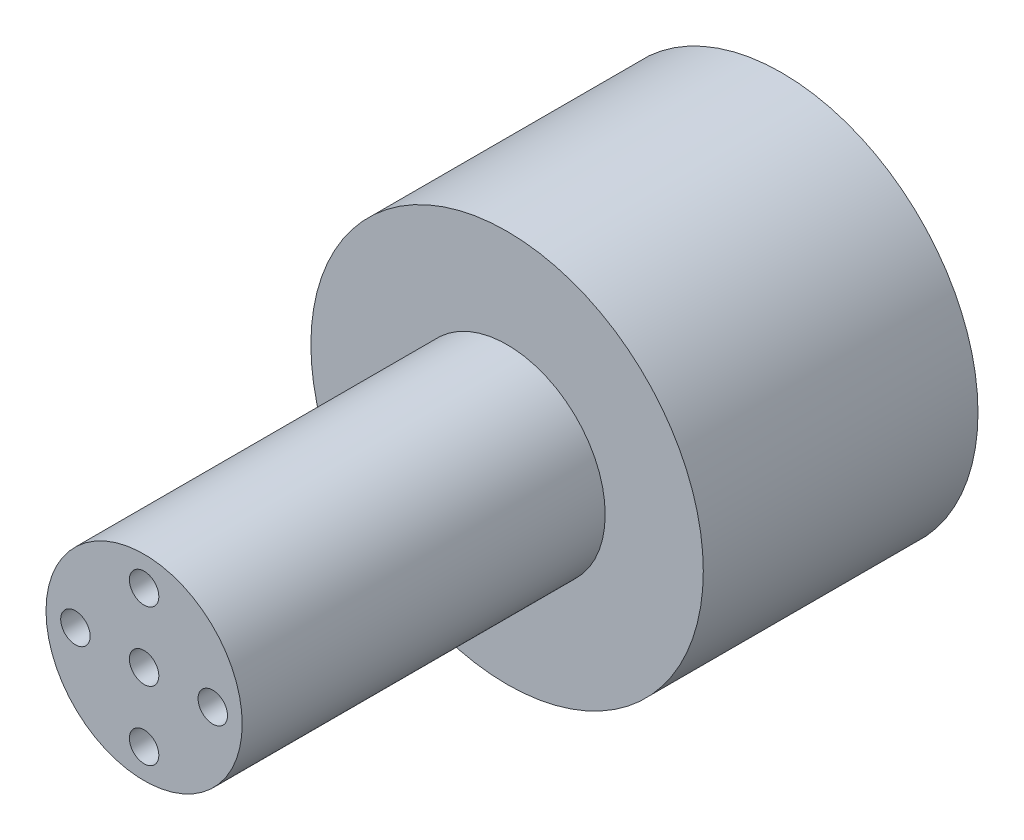
ISO-10303-21;
HEADER;
FILE_DESCRIPTION(('STEP AP214'),'2;1');
FILE_NAME('part.step','',(''),(''),'','','');
FILE_SCHEMA(('AUTOMOTIVE_DESIGN { 1 0 10303 214 1 1 1 1 }'));
ENDSEC;
DATA;
#1=APPLICATION_CONTEXT('core data for automotive mechanical design processes');
#2=APPLICATION_PROTOCOL_DEFINITION('international standard','automotive_design',2000,#1);
#3=PRODUCT_CONTEXT('',#1,'mechanical');
#4=PRODUCT('Part','Part','',(#3));
#5=PRODUCT_RELATED_PRODUCT_CATEGORY('part','',(#4));
#6=PRODUCT_DEFINITION_FORMATION('','',#4);
#7=PRODUCT_DEFINITION_CONTEXT('part definition',#1,'design');
#8=PRODUCT_DEFINITION('design','',#6,#7);
#9=PRODUCT_DEFINITION_SHAPE('','',#8);
#10=(LENGTH_UNIT() NAMED_UNIT(*) SI_UNIT(.MILLI.,.METRE.));
#11=(NAMED_UNIT(*) PLANE_ANGLE_UNIT() SI_UNIT($,.RADIAN.));
#12=(NAMED_UNIT(*) SI_UNIT($,.STERADIAN.) SOLID_ANGLE_UNIT());
#13=UNCERTAINTY_MEASURE_WITH_UNIT(LENGTH_MEASURE(1.E-05),#10,'distance_accuracy_value','');
#14=(GEOMETRIC_REPRESENTATION_CONTEXT(3) GLOBAL_UNCERTAINTY_ASSIGNED_CONTEXT((#13)) GLOBAL_UNIT_ASSIGNED_CONTEXT((#10,
#11,#12)) REPRESENTATION_CONTEXT('',''));
#15=CARTESIAN_POINT('',(0.,0.,0.));
#16=DIRECTION('',(0.,0.,1.));
#17=DIRECTION('',(1.,0.,0.));
#18=AXIS2_PLACEMENT_3D('',#15,#16,#17);
#19=CARTESIAN_POINT('',(0.,0.,65.));
#20=DIRECTION('',(0.,0.,-1.));
#21=DIRECTION('',(-1.,0.,0.));
#22=AXIS2_PLACEMENT_3D('',#19,#20,#21);
#23=CYLINDRICAL_SURFACE('',#22,10.);
#24=CARTESIAN_POINT('',(0.,0.,65.));
#25=DIRECTION('',(0.,0.,1.));
#26=DIRECTION('',(1.,0.,0.));
#27=AXIS2_PLACEMENT_3D('',#24,#25,#26);
#28=CIRCLE('',#27,10.);
#29=CARTESIAN_POINT('',(10.,0.,65.));
#30=VERTEX_POINT('',#29);
#31=EDGE_CURVE('E95',#30,#30,#28,.T.);
#32=ORIENTED_EDGE('',*,*,#31,.F.);
#33=EDGE_LOOP('',(#32));
#34=FACE_BOUND('',#33,.T.);
#35=CARTESIAN_POINT('',(-9.68245836551854,-2.5,30.5));
#36=CARTESIAN_POINT('',(-9.68245064107173,-2.5000080093561,30.4308622148504));
#37=CARTESIAN_POINT('',(-9.68319871214971,-2.49713210094488,30.361729180435));
#38=CARTESIAN_POINT('',(-9.68614915569249,-2.4856746565857,30.2239800754158));
#39=CARTESIAN_POINT('',(-9.68835128344071,-2.477094080727,30.1553639197868));
#40=CARTESIAN_POINT('',(-9.69414685608169,-2.4543119967113,30.0192670019005));
#41=CARTESIAN_POINT('',(-9.69773754375151,-2.4401216265234,29.9517842644045));
#42=CARTESIAN_POINT('',(-9.70619672728078,-2.40625174004096,29.8183111896897));
#43=CARTESIAN_POINT('',(-9.71106524071264,-2.3865721482595,29.7523208730079));
#44=CARTESIAN_POINT('',(-9.7273836995917,-2.31951549528412,29.5572899189044));
#45=CARTESIAN_POINT('',(-9.74055281563065,-2.26409745840538,29.4310525501598));
#46=CARTESIAN_POINT('',(-9.76997886207529,-2.13353299875773,29.1896941253783));
#47=CARTESIAN_POINT('',(-9.78623662015741,-2.05838128580475,29.0745760615299));
#48=CARTESIAN_POINT('',(-9.82040642202059,-1.88871268115754,28.8561478090907));
#49=CARTESIAN_POINT('',(-9.83834473874501,-1.79384357452292,28.7531147987879));
#50=CARTESIAN_POINT('',(-9.87362764688863,-1.58818904866331,28.5642427615698));
#51=CARTESIAN_POINT('',(-9.89097214303631,-1.47740109012642,28.4784064830489));
#52=CARTESIAN_POINT('',(-9.92340454696925,-1.24114235858888,28.3252230468106));
#53=CARTESIAN_POINT('',(-9.93845761433587,-1.11548838031036,28.2581504075271));
#54=CARTESIAN_POINT('',(-9.96430865897157,-0.854256447638927,28.1461880170502));
#55=CARTESIAN_POINT('',(-9.97510747358589,-0.718680452386957,28.1012939001168));
#56=CARTESIAN_POINT('',(-9.99104749942438,-0.444360278975139,28.0358525563978));
#57=CARTESIAN_POINT('',(-9.99629882234408,-0.305735807058582,28.0148308292082));
#58=CARTESIAN_POINT('',(-10.0009359539588,-0.0268319371530167,27.9962415608778));
#59=CARTESIAN_POINT('',(-10.0003224998861,0.11344725061566,27.9986710717975));
#60=CARTESIAN_POINT('',(-9.99338093409452,0.388381231898418,28.0265749118748));
#61=CARTESIAN_POINT('',(-9.98717996692084,0.52309175420709,28.051536542212));
#62=CARTESIAN_POINT('',(-9.96990826592558,0.786346777853405,28.1229716972435));
#63=CARTESIAN_POINT('',(-9.95883731664275,0.914891006098329,28.1694461737295));
#64=CARTESIAN_POINT('',(-9.93287494404107,1.16351821502264,28.2830032018703));
#65=CARTESIAN_POINT('',(-9.91794984568668,1.28351407399524,28.350268485634));
#66=CARTESIAN_POINT('',(-9.88589863855019,1.51069157808542,28.5033578245317));
#67=CARTESIAN_POINT('',(-9.86877219833489,1.61787128890855,28.5891846756191));
#68=CARTESIAN_POINT('',(-9.83363915056657,1.81942347426832,28.7796972802176));
#69=CARTESIAN_POINT('',(-9.81562126192392,1.9133727576345,28.884829091353));
#70=CARTESIAN_POINT('',(-9.78115420711838,2.08242393796641,29.1095746673159));
#71=CARTESIAN_POINT('',(-9.76470547114267,2.15752067561301,29.2291923832095));
#72=CARTESIAN_POINT('',(-9.73519533958994,2.28701177321454,29.4803639945588));
#73=CARTESIAN_POINT('',(-9.72215264997332,2.34129254471755,29.6119786622344));
#74=CARTESIAN_POINT('',(-9.70117647043109,2.42675587962519,29.8827923210515));
#75=CARTESIAN_POINT('',(-9.693235344986,2.45797297303244,30.0219796378971));
#76=CARTESIAN_POINT('',(-9.6863822666606,2.48476158787698,30.2186434518918));
#77=CARTESIAN_POINT('',(-9.68491307675692,2.49047697741524,30.2747992580159));
#78=CARTESIAN_POINT('',(-9.6829515607634,2.49809189424097,30.3872944747475));
#79=CARTESIAN_POINT('',(-9.68245765421489,2.49999759523778,30.4436334398651));
#80=CARTESIAN_POINT('',(-9.68245836551854,2.5,30.5));
#81=B_SPLINE_CURVE_WITH_KNOTS('',3,(#35,#36,#37,#38,#39,#40,#41,#42,#43,#44,#45,#46,#47,#48,#49,
#50,#51,#52,#53,#54,#55,#56,#57,#58,#59,#60,#61,#62,#63,#64,#65,#66,#67,#68,#69,#70,#71,#72,#73,
#74,#75,#76,#77,#78,#79,#80),.UNSPECIFIED.,.F.,.F.,(4,2,2,2,2,2,2,2,2,2,2,2,2,2,2,2,2,2,2,2,2,2,
4),(0.,0.207341325849423,0.414647765211628,0.62154465857586,0.82844439729415,1.2418326948221,
1.65533192641023,2.07697423316329,2.49868387344134,2.92627416704923,3.35378025790397,
3.77263152747648,4.19143014600933,4.60093312657525,5.01045422648931,5.42368222585276,
5.83697251370158,6.26140522795691,6.68595396911754,7.11278749362004,7.538980678093,
7.70826570767019,7.87727618290649),.UNSPECIFIED.);
#82=CARTESIAN_POINT('',(-9.68245836551854,-2.5,30.5));
#83=VERTEX_POINT('',#82);
#84=CARTESIAN_POINT('',(-10.,0.,28.));
#85=VERTEX_POINT('',#84);
#86=EDGE_CURVE('E55',#83,#85,#81,.T.);
#87=ORIENTED_EDGE('',*,*,#86,.T.);
#88=CARTESIAN_POINT('',(0.,0.,28.));
#89=DIRECTION('',(0.,0.,-1.));
#90=DIRECTION('',(-1.,0.,0.));
#91=AXIS2_PLACEMENT_3D('',#88,#89,#90);
#92=CIRCLE('',#91,10.);
#93=EDGE_CURVE('E84',#85,#85,#92,.T.);
#94=ORIENTED_EDGE('',*,*,#93,.F.);
#95=CARTESIAN_POINT('',(-9.68245836551854,2.5,30.5));
#96=VERTEX_POINT('',#95);
#97=EDGE_CURVE('E61',#85,#96,#81,.T.);
#98=ORIENTED_EDGE('',*,*,#97,.T.);
#99=DIRECTION('',(0.,0.,-1.));
#100=VECTOR('',#99,1.);
#101=CARTESIAN_POINT('',(-9.68245836551854,2.5,65.));
#102=LINE('',#101,#100);
#103=CARTESIAN_POINT('',(-9.68245836551854,2.5,35.55));
#104=VERTEX_POINT('',#103);
#105=EDGE_CURVE('E11',#96,#104,#102,.F.);
#106=ORIENTED_EDGE('',*,*,#105,.T.);
#107=CARTESIAN_POINT('',(-9.68245836551854,2.5,35.55));
#108=CARTESIAN_POINT('',(-9.68245064107173,2.5000080093561,35.6191377851496));
#109=CARTESIAN_POINT('',(-9.68319871214971,2.49713210094488,35.688270819565));
#110=CARTESIAN_POINT('',(-9.68614915569249,2.4856746565857,35.8260199245842));
#111=CARTESIAN_POINT('',(-9.68835128344071,2.477094080727,35.8946360802132));
#112=CARTESIAN_POINT('',(-9.69414685608169,2.4543119967113,36.0307329980995));
#113=CARTESIAN_POINT('',(-9.69773754375151,2.4401216265234,36.0982157355955));
#114=CARTESIAN_POINT('',(-9.70619672728078,2.40625174004096,36.2316888103103));
#115=CARTESIAN_POINT('',(-9.71106524071264,2.3865721482595,36.2976791269921));
#116=CARTESIAN_POINT('',(-9.7273836995917,2.31951549528412,36.4927100810956));
#117=CARTESIAN_POINT('',(-9.74055281563065,2.26409745840538,36.6189474498402));
#118=CARTESIAN_POINT('',(-9.76997886207529,2.13353299875773,36.8603058746217));
#119=CARTESIAN_POINT('',(-9.78623662015741,2.05838128580475,36.9754239384701));
#120=CARTESIAN_POINT('',(-9.82040642202059,1.88871268115754,37.1938521909093));
#121=CARTESIAN_POINT('',(-9.83834473874501,1.79384357452292,37.296885201212));
#122=CARTESIAN_POINT('',(-9.87362764688863,1.58818904866332,37.4857572384302));
#123=CARTESIAN_POINT('',(-9.89097214303631,1.47740109012642,37.5715935169511));
#124=CARTESIAN_POINT('',(-9.92340454696925,1.24114235858889,37.7247769531894));
#125=CARTESIAN_POINT('',(-9.93845761433587,1.11548838031036,37.7918495924729));
#126=CARTESIAN_POINT('',(-9.96430865897157,0.854256447638931,37.9038119829498));
#127=CARTESIAN_POINT('',(-9.97510747358589,0.718680452386961,37.9487060998832));
#128=CARTESIAN_POINT('',(-9.99104749942438,0.444360278975144,38.0141474436022));
#129=CARTESIAN_POINT('',(-9.99629882234408,0.305735807058587,38.0351691707918));
#130=CARTESIAN_POINT('',(-10.0009359539588,0.0268319371530223,38.0537584391222));
#131=CARTESIAN_POINT('',(-10.0003224998861,-0.113447250615655,38.0513289282025));
#132=CARTESIAN_POINT('',(-9.99338093409452,-0.388381231898412,38.0234250881252));
#133=CARTESIAN_POINT('',(-9.98717996692084,-0.523091754207085,37.998463457788));
#134=CARTESIAN_POINT('',(-9.96990826592558,-0.7863467778534,37.9270283027565));
#135=CARTESIAN_POINT('',(-9.95883731664276,-0.914891006098325,37.8805538262705));
#136=CARTESIAN_POINT('',(-9.93287494404107,-1.16351821502264,37.7669967981297));
#137=CARTESIAN_POINT('',(-9.91794984568668,-1.28351407399523,37.699731514366));
#138=CARTESIAN_POINT('',(-9.88589863855019,-1.51069157808542,37.5466421754683));
#139=CARTESIAN_POINT('',(-9.8687721983349,-1.61787128890855,37.4608153243809));
#140=CARTESIAN_POINT('',(-9.83363915056657,-1.81942347426832,37.2703027197824));
#141=CARTESIAN_POINT('',(-9.81562126192392,-1.9133727576345,37.165170908647));
#142=CARTESIAN_POINT('',(-9.78115420711838,-2.08242393796641,36.9404253326841));
#143=CARTESIAN_POINT('',(-9.76470547114267,-2.15752067561301,36.8208076167905));
#144=CARTESIAN_POINT('',(-9.73519533958994,-2.28701177321454,36.5696360054412));
#145=CARTESIAN_POINT('',(-9.72215264997332,-2.34129254471755,36.4380213377656));
#146=CARTESIAN_POINT('',(-9.70117647043109,-2.42675587962519,36.1672076789485));
#147=CARTESIAN_POINT('',(-9.693235344986,-2.45797297303244,36.0280203621029));
#148=CARTESIAN_POINT('',(-9.6863822666606,-2.48476158787698,35.8313565481082));
#149=CARTESIAN_POINT('',(-9.68491307675692,-2.49047697741524,35.7752007419841));
#150=CARTESIAN_POINT('',(-9.6829515607634,-2.49809189424097,35.6627055252526));
#151=CARTESIAN_POINT('',(-9.68245765421489,-2.49999759523778,35.6063665601349));
#152=CARTESIAN_POINT('',(-9.68245836551854,-2.5,35.55));
#153=B_SPLINE_CURVE_WITH_KNOTS('',3,(#107,#108,#109,#110,#111,#112,#113,#114,#115,#116,#117,
#118,#119,#120,#121,#122,#123,#124,#125,#126,#127,#128,#129,#130,#131,#132,#133,#134,#135,#136,
#137,#138,#139,#140,#141,#142,#143,#144,#145,#146,#147,#148,#149,#150,#151,#152),.UNSPECIFIED.,
.F.,.F.,(4,2,2,2,2,2,2,2,2,2,2,2,2,2,2,2,2,2,2,2,2,2,4),(0.,0.207341325849427,0.414647765211638,
0.62154465857586,0.828444397294147,1.2418326948221,1.65533192641022,2.07697423316328,
2.49868387344134,2.92627416704922,3.35378025790397,3.77263152747647,4.19143014600932,
4.60093312657524,5.01045422648931,5.42368222585276,5.83697251370157,6.2614052279569,
6.68595396911753,7.11278749362004,7.538980678093,7.70826570767017,7.87727618290649),.UNSPECIFIED.);
#154=CARTESIAN_POINT('',(-9.68245836551854,-2.5,35.55));
#155=VERTEX_POINT('',#154);
#156=EDGE_CURVE('E93',#104,#155,#153,.T.);
#157=ORIENTED_EDGE('',*,*,#156,.T.);
#158=DIRECTION('',(0.,0.,-1.));
#159=VECTOR('',#158,1.);
#160=CARTESIAN_POINT('',(-9.68245836551854,-2.5,65.));
#161=LINE('',#160,#159);
#162=EDGE_CURVE('E48',#155,#83,#161,.T.);
#163=ORIENTED_EDGE('',*,*,#162,.T.);
#164=EDGE_LOOP('',(#87,#94,#98,#106,#157,#163));
#165=FACE_BOUND('',#164,.T.);
#166=ADVANCED_FACE('F39',(#34,#165),#23,.T.);
#167=CARTESIAN_POINT('',(0.,0.,65.));
#168=DIRECTION('',(0.,0.,1.));
#169=DIRECTION('',(1.,0.,0.));
#170=AXIS2_PLACEMENT_3D('',#167,#168,#169);
#171=PLANE('',#170);
#172=CARTESIAN_POINT('',(0.,0.,65.));
#173=DIRECTION('',(0.,0.,1.));
#174=DIRECTION('',(1.,0.,0.));
#175=AXIS2_PLACEMENT_3D('',#172,#173,#174);
#176=CIRCLE('',#175,1.5);
#177=CARTESIAN_POINT('',(1.5,0.,65.));
#178=VERTEX_POINT('',#177);
#179=EDGE_CURVE('E212',#178,#178,#176,.T.);
#180=ORIENTED_EDGE('',*,*,#179,.F.);
#181=EDGE_LOOP('',(#180));
#182=FACE_BOUND('',#181,.T.);
#183=CARTESIAN_POINT('',(0.,7.,65.));
#184=DIRECTION('',(0.,0.,1.));
#185=DIRECTION('',(1.,0.,0.));
#186=AXIS2_PLACEMENT_3D('',#183,#184,#185);
#187=CIRCLE('',#186,1.5);
#188=CARTESIAN_POINT('',(1.5,7.,65.));
#189=VERTEX_POINT('',#188);
#190=EDGE_CURVE('E205',#189,#189,#187,.T.);
#191=ORIENTED_EDGE('',*,*,#190,.F.);
#192=EDGE_LOOP('',(#191));
#193=FACE_BOUND('',#192,.T.);
#194=CARTESIAN_POINT('',(7.,0.,65.));
#195=DIRECTION('',(0.,0.,1.));
#196=DIRECTION('',(1.,0.,0.));
#197=AXIS2_PLACEMENT_3D('',#194,#195,#196);
#198=CIRCLE('',#197,1.5);
#199=CARTESIAN_POINT('',(8.5,0.,65.));
#200=VERTEX_POINT('',#199);
#201=EDGE_CURVE('E197',#200,#200,#198,.T.);
#202=ORIENTED_EDGE('',*,*,#201,.F.);
#203=EDGE_LOOP('',(#202));
#204=FACE_BOUND('',#203,.T.);
#205=CARTESIAN_POINT('',(0.,-7.,65.));
#206=DIRECTION('',(0.,0.,1.));
#207=DIRECTION('',(1.,0.,0.));
#208=AXIS2_PLACEMENT_3D('',#205,#206,#207);
#209=CIRCLE('',#208,1.5);
#210=CARTESIAN_POINT('',(1.49999999999995,-7.,65.));
#211=VERTEX_POINT('',#210);
#212=EDGE_CURVE('E189',#211,#211,#209,.T.);
#213=ORIENTED_EDGE('',*,*,#212,.F.);
#214=EDGE_LOOP('',(#213));
#215=FACE_BOUND('',#214,.T.);
#216=CARTESIAN_POINT('',(-7.,0.,65.));
#217=DIRECTION('',(0.,0.,1.));
#218=DIRECTION('',(1.,0.,0.));
#219=AXIS2_PLACEMENT_3D('',#216,#217,#218);
#220=CIRCLE('',#219,1.5);
#221=CARTESIAN_POINT('',(-5.5,0.,65.));
#222=VERTEX_POINT('',#221);
#223=EDGE_CURVE('E180',#222,#222,#220,.T.);
#224=ORIENTED_EDGE('',*,*,#223,.F.);
#225=EDGE_LOOP('',(#224));
#226=FACE_BOUND('',#225,.T.);
#227=ORIENTED_EDGE('',*,*,#31,.T.);
#228=EDGE_LOOP('',(#227));
#229=FACE_BOUND('',#228,.T.);
#230=ADVANCED_FACE('F113',(#182,#193,#204,#215,#226,#229),#171,.T.);
#231=CARTESIAN_POINT('',(-7.5,0.,30.5));
#232=DIRECTION('',(-1.,0.,0.));
#233=DIRECTION('',(0.,0.,1.));
#234=AXIS2_PLACEMENT_3D('',#231,#232,#233);
#235=CYLINDRICAL_SURFACE('',#234,2.5);
#236=ORIENTED_EDGE('',*,*,#97,.F.);
#237=ORIENTED_EDGE('',*,*,#86,.F.);
#238=DIRECTION('',(-1.,0.,0.));
#239=VECTOR('',#238,1.);
#240=CARTESIAN_POINT('',(-7.5,-2.5,30.5));
#241=LINE('',#240,#239);
#242=CARTESIAN_POINT('',(-7.5,-2.5,30.5));
#243=VERTEX_POINT('',#242);
#244=EDGE_CURVE('E145',#243,#83,#241,.T.);
#245=ORIENTED_EDGE('',*,*,#244,.F.);
#246=CARTESIAN_POINT('',(-7.5,0.,30.5));
#247=DIRECTION('',(-1.,0.,0.));
#248=DIRECTION('',(0.,0.,1.));
#249=AXIS2_PLACEMENT_3D('',#246,#247,#248);
#250=CIRCLE('',#249,2.5);
#251=CARTESIAN_POINT('',(-7.5,2.5,30.5));
#252=VERTEX_POINT('',#251);
#253=EDGE_CURVE('E167',#252,#243,#250,.T.);
#254=ORIENTED_EDGE('',*,*,#253,.F.);
#255=DIRECTION('',(-1.,0.,0.));
#256=VECTOR('',#255,1.);
#257=CARTESIAN_POINT('',(-7.5,2.5,30.5));
#258=LINE('',#257,#256);
#259=EDGE_CURVE('E91',#252,#96,#258,.T.);
#260=ORIENTED_EDGE('',*,*,#259,.T.);
#261=EDGE_LOOP('',(#236,#237,#245,#254,#260));
#262=FACE_BOUND('',#261,.T.);
#263=ADVANCED_FACE('F89',(#262),#235,.F.);
#264=CARTESIAN_POINT('',(-7.5,2.5,30.5));
#265=DIRECTION('',(0.,1.,0.));
#266=DIRECTION('',(0.,0.,1.));
#267=AXIS2_PLACEMENT_3D('',#264,#265,#266);
#268=PLANE('',#267);
#269=ORIENTED_EDGE('',*,*,#259,.F.);
#270=DIRECTION('',(0.,0.,-1.));
#271=VECTOR('',#270,1.);
#272=CARTESIAN_POINT('',(-7.5,2.5,30.5));
#273=LINE('',#272,#271);
#274=CARTESIAN_POINT('',(-7.5,2.5,35.55));
#275=VERTEX_POINT('',#274);
#276=EDGE_CURVE('E149',#275,#252,#273,.T.);
#277=ORIENTED_EDGE('',*,*,#276,.F.);
#278=DIRECTION('',(-1.,0.,0.));
#279=VECTOR('',#278,1.);
#280=CARTESIAN_POINT('',(-7.5,2.5,35.55));
#281=LINE('',#280,#279);
#282=EDGE_CURVE('E142',#275,#104,#281,.T.);
#283=ORIENTED_EDGE('',*,*,#282,.T.);
#284=ORIENTED_EDGE('',*,*,#105,.F.);
#285=EDGE_LOOP('',(#269,#277,#283,#284));
#286=FACE_BOUND('',#285,.T.);
#287=ADVANCED_FACE('F112',(#286),#268,.F.);
#288=CARTESIAN_POINT('',(-7.5,0.,35.55));
#289=DIRECTION('',(-1.,0.,0.));
#290=DIRECTION('',(0.,0.,1.));
#291=AXIS2_PLACEMENT_3D('',#288,#289,#290);
#292=CYLINDRICAL_SURFACE('',#291,2.5);
#293=ORIENTED_EDGE('',*,*,#282,.F.);
#294=CARTESIAN_POINT('',(-7.5,0.,35.55));
#295=DIRECTION('',(-1.,0.,0.));
#296=DIRECTION('',(0.,0.,1.));
#297=AXIS2_PLACEMENT_3D('',#294,#295,#296);
#298=CIRCLE('',#297,2.5);
#299=CARTESIAN_POINT('',(-7.5,-2.5,35.55));
#300=VERTEX_POINT('',#299);
#301=EDGE_CURVE('E159',#300,#275,#298,.T.);
#302=ORIENTED_EDGE('',*,*,#301,.F.);
#303=DIRECTION('',(-1.,0.,0.));
#304=VECTOR('',#303,1.);
#305=CARTESIAN_POINT('',(-7.5,-2.5,35.55));
#306=LINE('',#305,#304);
#307=EDGE_CURVE('E148',#300,#155,#306,.T.);
#308=ORIENTED_EDGE('',*,*,#307,.T.);
#309=ORIENTED_EDGE('',*,*,#156,.F.);
#310=EDGE_LOOP('',(#293,#302,#308,#309));
#311=FACE_BOUND('',#310,.T.);
#312=ADVANCED_FACE('F263',(#311),#292,.F.);
#313=CARTESIAN_POINT('',(-7.5,-2.5,30.5));
#314=DIRECTION('',(0.,-1.,0.));
#315=DIRECTION('',(0.,0.,-1.));
#316=AXIS2_PLACEMENT_3D('',#313,#314,#315);
#317=PLANE('',#316);
#318=ORIENTED_EDGE('',*,*,#307,.F.);
#319=DIRECTION('',(0.,0.,1.));
#320=VECTOR('',#319,1.);
#321=CARTESIAN_POINT('',(-7.5,-2.5,30.5));
#322=LINE('',#321,#320);
#323=EDGE_CURVE('E163',#243,#300,#322,.T.);
#324=ORIENTED_EDGE('',*,*,#323,.F.);
#325=ORIENTED_EDGE('',*,*,#244,.T.);
#326=ORIENTED_EDGE('',*,*,#162,.F.);
#327=EDGE_LOOP('',(#318,#324,#325,#326));
#328=FACE_BOUND('',#327,.T.);
#329=ADVANCED_FACE('F114',(#328),#317,.F.);
#330=CARTESIAN_POINT('',(-7.5,0.,30.5));
#331=DIRECTION('',(-1.,0.,0.));
#332=DIRECTION('',(0.,0.,1.));
#333=AXIS2_PLACEMENT_3D('',#330,#331,#332);
#334=PLANE('',#333);
#335=ORIENTED_EDGE('',*,*,#253,.T.);
#336=ORIENTED_EDGE('',*,*,#323,.T.);
#337=ORIENTED_EDGE('',*,*,#301,.T.);
#338=ORIENTED_EDGE('',*,*,#276,.T.);
#339=EDGE_LOOP('',(#335,#336,#337,#338));
#340=FACE_BOUND('',#339,.T.);
#341=ADVANCED_FACE('F256',(#340),#334,.T.);
#342=CARTESIAN_POINT('',(0.,0.,28.));
#343=DIRECTION('',(0.,0.,-1.));
#344=DIRECTION('',(-1.,0.,0.));
#345=AXIS2_PLACEMENT_3D('',#342,#343,#344);
#346=PLANE('',#345);
#347=CARTESIAN_POINT('',(0.,0.,28.));
#348=DIRECTION('',(0.,0.,-1.));
#349=DIRECTION('',(-1.,0.,0.));
#350=AXIS2_PLACEMENT_3D('',#347,#348,#349);
#351=CIRCLE('',#350,20.);
#352=CARTESIAN_POINT('',(-20.,0.,28.));
#353=VERTEX_POINT('',#352);
#354=EDGE_CURVE('E172',#353,#353,#351,.T.);
#355=ORIENTED_EDGE('',*,*,#354,.F.);
#356=EDGE_LOOP('',(#355));
#357=FACE_BOUND('',#356,.T.);
#358=ORIENTED_EDGE('',*,*,#93,.T.);
#359=EDGE_LOOP('',(#358));
#360=FACE_BOUND('',#359,.T.);
#361=ADVANCED_FACE('F129',(#357,#360),#346,.F.);
#362=CARTESIAN_POINT('',(0.,0.,28.));
#363=DIRECTION('',(0.,0.,-1.));
#364=DIRECTION('',(-1.,0.,0.));
#365=AXIS2_PLACEMENT_3D('',#362,#363,#364);
#366=CYLINDRICAL_SURFACE('',#365,20.);
#367=ORIENTED_EDGE('',*,*,#354,.T.);
#368=EDGE_LOOP('',(#367));
#369=FACE_BOUND('',#368,.T.);
#370=CARTESIAN_POINT('',(0.,0.,0.));
#371=DIRECTION('',(0.,0.,-1.));
#372=DIRECTION('',(-1.,0.,0.));
#373=AXIS2_PLACEMENT_3D('',#370,#371,#372);
#374=CIRCLE('',#373,20.);
#375=CARTESIAN_POINT('',(-20.,0.,0.));
#376=VERTEX_POINT('',#375);
#377=EDGE_CURVE('E173',#376,#376,#374,.T.);
#378=ORIENTED_EDGE('',*,*,#377,.F.);
#379=EDGE_LOOP('',(#378));
#380=FACE_BOUND('',#379,.T.);
#381=ADVANCED_FACE('F120',(#369,#380),#366,.T.);
#382=CARTESIAN_POINT('',(0.,0.,0.));
#383=DIRECTION('',(0.,0.,1.));
#384=DIRECTION('',(1.,0.,0.));
#385=AXIS2_PLACEMENT_3D('',#382,#383,#384);
#386=PLANE('',#385);
#387=ORIENTED_EDGE('',*,*,#377,.T.);
#388=EDGE_LOOP('',(#387));
#389=FACE_BOUND('',#388,.T.);
#390=ADVANCED_FACE('F117',(#389),#386,.F.);
#391=CARTESIAN_POINT('',(-7.,0.,55.));
#392=DIRECTION('',(0.,0.,1.));
#393=DIRECTION('',(1.,0.,0.));
#394=AXIS2_PLACEMENT_3D('',#391,#392,#393);
#395=CYLINDRICAL_SURFACE('',#394,1.5);
#396=CARTESIAN_POINT('',(-7.,0.,55.));
#397=DIRECTION('',(0.,0.,1.));
#398=DIRECTION('',(1.,0.,0.));
#399=AXIS2_PLACEMENT_3D('',#396,#397,#398);
#400=CIRCLE('',#399,1.5);
#401=CARTESIAN_POINT('',(-5.5,0.,55.));
#402=VERTEX_POINT('',#401);
#403=EDGE_CURVE('E184',#402,#402,#400,.T.);
#404=ORIENTED_EDGE('',*,*,#403,.F.);
#405=EDGE_LOOP('',(#404));
#406=FACE_BOUND('',#405,.T.);
#407=ORIENTED_EDGE('',*,*,#223,.T.);
#408=EDGE_LOOP('',(#407));
#409=FACE_BOUND('',#408,.T.);
#410=ADVANCED_FACE('F119',(#406,#409),#395,.F.);
#411=CARTESIAN_POINT('',(-7.,0.,55.));
#412=DIRECTION('',(0.,0.,1.));
#413=DIRECTION('',(1.,0.,0.));
#414=AXIS2_PLACEMENT_3D('',#411,#412,#413);
#415=PLANE('',#414);
#416=ORIENTED_EDGE('',*,*,#403,.T.);
#417=EDGE_LOOP('',(#416));
#418=FACE_BOUND('',#417,.T.);
#419=ADVANCED_FACE('F126',(#418),#415,.T.);
#420=CARTESIAN_POINT('',(0.,-7.,55.));
#421=DIRECTION('',(0.,0.,1.));
#422=DIRECTION('',(1.,0.,0.));
#423=AXIS2_PLACEMENT_3D('',#420,#421,#422);
#424=CYLINDRICAL_SURFACE('',#423,1.5);
#425=CARTESIAN_POINT('',(0.,-7.,55.));
#426=DIRECTION('',(0.,0.,1.));
#427=DIRECTION('',(1.,0.,0.));
#428=AXIS2_PLACEMENT_3D('',#425,#426,#427);
#429=CIRCLE('',#428,1.5);
#430=CARTESIAN_POINT('',(1.49999999999995,-7.,55.));
#431=VERTEX_POINT('',#430);
#432=EDGE_CURVE('E193',#431,#431,#429,.T.);
#433=ORIENTED_EDGE('',*,*,#432,.F.);
#434=EDGE_LOOP('',(#433));
#435=FACE_BOUND('',#434,.T.);
#436=ORIENTED_EDGE('',*,*,#212,.T.);
#437=EDGE_LOOP('',(#436));
#438=FACE_BOUND('',#437,.T.);
#439=ADVANCED_FACE('F238',(#435,#438),#424,.F.);
#440=CARTESIAN_POINT('',(0.,-7.,55.));
#441=DIRECTION('',(0.,0.,1.));
#442=DIRECTION('',(1.,0.,0.));
#443=AXIS2_PLACEMENT_3D('',#440,#441,#442);
#444=PLANE('',#443);
#445=ORIENTED_EDGE('',*,*,#432,.T.);
#446=EDGE_LOOP('',(#445));
#447=FACE_BOUND('',#446,.T.);
#448=ADVANCED_FACE('F240',(#447),#444,.T.);
#449=CARTESIAN_POINT('',(7.,0.,55.));
#450=DIRECTION('',(0.,0.,1.));
#451=DIRECTION('',(1.,0.,0.));
#452=AXIS2_PLACEMENT_3D('',#449,#450,#451);
#453=CYLINDRICAL_SURFACE('',#452,1.5);
#454=CARTESIAN_POINT('',(7.,0.,55.));
#455=DIRECTION('',(0.,0.,1.));
#456=DIRECTION('',(1.,0.,0.));
#457=AXIS2_PLACEMENT_3D('',#454,#455,#456);
#458=CIRCLE('',#457,1.5);
#459=CARTESIAN_POINT('',(8.5,0.,55.));
#460=VERTEX_POINT('',#459);
#461=EDGE_CURVE('E201',#460,#460,#458,.T.);
#462=ORIENTED_EDGE('',*,*,#461,.F.);
#463=EDGE_LOOP('',(#462));
#464=FACE_BOUND('',#463,.T.);
#465=ORIENTED_EDGE('',*,*,#201,.T.);
#466=EDGE_LOOP('',(#465));
#467=FACE_BOUND('',#466,.T.);
#468=ADVANCED_FACE('F247',(#464,#467),#453,.F.);
#469=CARTESIAN_POINT('',(7.,0.,55.));
#470=DIRECTION('',(0.,0.,1.));
#471=DIRECTION('',(1.,0.,0.));
#472=AXIS2_PLACEMENT_3D('',#469,#470,#471);
#473=PLANE('',#472);
#474=ORIENTED_EDGE('',*,*,#461,.T.);
#475=EDGE_LOOP('',(#474));
#476=FACE_BOUND('',#475,.T.);
#477=ADVANCED_FACE('F327',(#476),#473,.T.);
#478=CARTESIAN_POINT('',(0.,7.,55.));
#479=DIRECTION('',(0.,0.,1.));
#480=DIRECTION('',(1.,0.,0.));
#481=AXIS2_PLACEMENT_3D('',#478,#479,#480);
#482=CYLINDRICAL_SURFACE('',#481,1.5);
#483=CARTESIAN_POINT('',(0.,7.,55.));
#484=DIRECTION('',(0.,0.,1.));
#485=DIRECTION('',(1.,0.,0.));
#486=AXIS2_PLACEMENT_3D('',#483,#484,#485);
#487=CIRCLE('',#486,1.5);
#488=CARTESIAN_POINT('',(1.5,7.,55.));
#489=VERTEX_POINT('',#488);
#490=EDGE_CURVE('E176',#489,#489,#487,.T.);
#491=ORIENTED_EDGE('',*,*,#490,.F.);
#492=EDGE_LOOP('',(#491));
#493=FACE_BOUND('',#492,.T.);
#494=ORIENTED_EDGE('',*,*,#190,.T.);
#495=EDGE_LOOP('',(#494));
#496=FACE_BOUND('',#495,.T.);
#497=ADVANCED_FACE('F336',(#493,#496),#482,.F.);
#498=CARTESIAN_POINT('',(0.,7.,55.));
#499=DIRECTION('',(0.,0.,1.));
#500=DIRECTION('',(1.,0.,0.));
#501=AXIS2_PLACEMENT_3D('',#498,#499,#500);
#502=PLANE('',#501);
#503=ORIENTED_EDGE('',*,*,#490,.T.);
#504=EDGE_LOOP('',(#503));
#505=FACE_BOUND('',#504,.T.);
#506=ADVANCED_FACE('F225',(#505),#502,.T.);
#507=CARTESIAN_POINT('',(0.,0.,55.));
#508=DIRECTION('',(0.,0.,1.));
#509=DIRECTION('',(1.,0.,0.));
#510=AXIS2_PLACEMENT_3D('',#507,#508,#509);
#511=CYLINDRICAL_SURFACE('',#510,1.5);
#512=CARTESIAN_POINT('',(0.,0.,55.));
#513=DIRECTION('',(0.,0.,1.));
#514=DIRECTION('',(1.,0.,0.));
#515=AXIS2_PLACEMENT_3D('',#512,#513,#514);
#516=CIRCLE('',#515,1.5);
#517=CARTESIAN_POINT('',(1.5,0.,55.));
#518=VERTEX_POINT('',#517);
#519=EDGE_CURVE('E185',#518,#518,#516,.T.);
#520=ORIENTED_EDGE('',*,*,#519,.F.);
#521=EDGE_LOOP('',(#520));
#522=FACE_BOUND('',#521,.T.);
#523=ORIENTED_EDGE('',*,*,#179,.T.);
#524=EDGE_LOOP('',(#523));
#525=FACE_BOUND('',#524,.T.);
#526=ADVANCED_FACE('F222',(#522,#525),#511,.F.);
#527=CARTESIAN_POINT('',(0.,0.,55.));
#528=DIRECTION('',(0.,0.,1.));
#529=DIRECTION('',(1.,0.,0.));
#530=AXIS2_PLACEMENT_3D('',#527,#528,#529);
#531=PLANE('',#530);
#532=ORIENTED_EDGE('',*,*,#519,.T.);
#533=EDGE_LOOP('',(#532));
#534=FACE_BOUND('',#533,.T.);
#535=ADVANCED_FACE('F220',(#534),#531,.T.);
#536=CLOSED_SHELL('',(#166,#230,#263,#287,#312,#329,#341,#361,#381,#390,#410,#419,#439,#448,
#468,#477,#497,#506,#526,#535));
#537=MANIFOLD_SOLID_BREP('B2',#536);
#538=ADVANCED_BREP_SHAPE_REPRESENTATION('',(#18,#537),#14);
#539=SHAPE_DEFINITION_REPRESENTATION(#9,#538);
ENDSEC;
END-ISO-10303-21;
